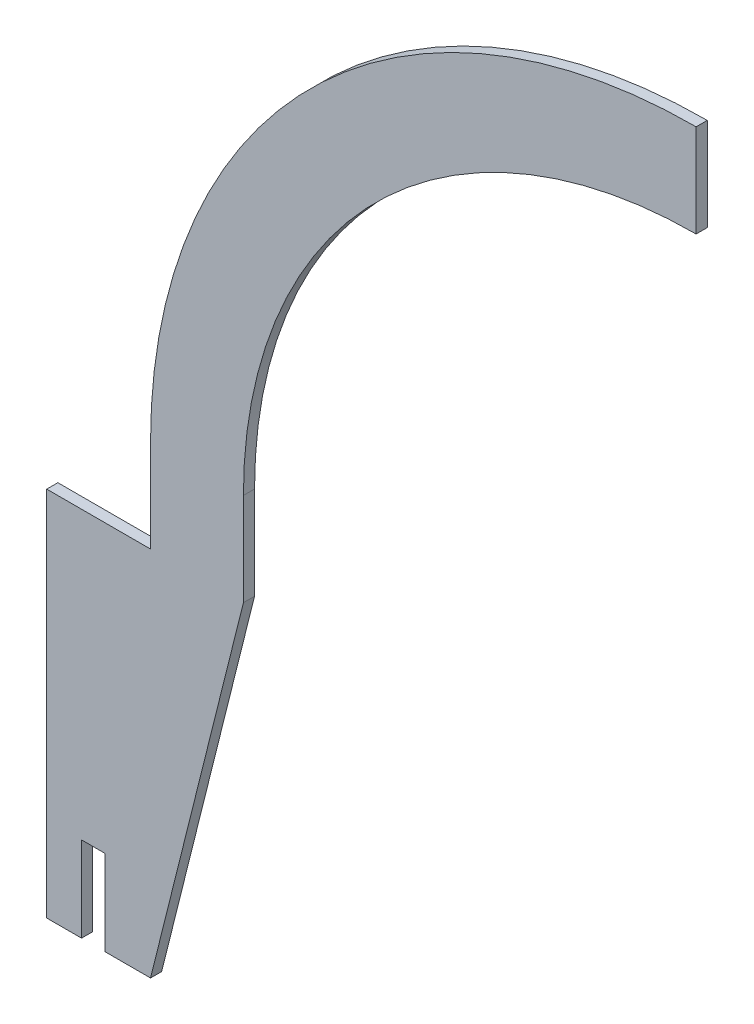
ISO-10303-21;
HEADER;
FILE_DESCRIPTION(('STEP AP214'),'2;1');
FILE_NAME('part.step','',(''),(''),'','','');
FILE_SCHEMA(('AUTOMOTIVE_DESIGN { 1 0 10303 214 1 1 1 1 }'));
ENDSEC;
DATA;
#1=APPLICATION_CONTEXT('core data for automotive mechanical design processes');
#2=APPLICATION_PROTOCOL_DEFINITION('international standard','automotive_design',2000,#1);
#3=PRODUCT_CONTEXT('',#1,'mechanical');
#4=PRODUCT('Part','Part','',(#3));
#5=PRODUCT_RELATED_PRODUCT_CATEGORY('part','',(#4));
#6=PRODUCT_DEFINITION_FORMATION('','',#4);
#7=PRODUCT_DEFINITION_CONTEXT('part definition',#1,'design');
#8=PRODUCT_DEFINITION('design','',#6,#7);
#9=PRODUCT_DEFINITION_SHAPE('','',#8);
#10=(LENGTH_UNIT() NAMED_UNIT(*) SI_UNIT(.MILLI.,.METRE.));
#11=(NAMED_UNIT(*) PLANE_ANGLE_UNIT() SI_UNIT($,.RADIAN.));
#12=(NAMED_UNIT(*) SI_UNIT($,.STERADIAN.) SOLID_ANGLE_UNIT());
#13=UNCERTAINTY_MEASURE_WITH_UNIT(LENGTH_MEASURE(1.E-05),#10,'distance_accuracy_value','');
#14=(GEOMETRIC_REPRESENTATION_CONTEXT(3) GLOBAL_UNCERTAINTY_ASSIGNED_CONTEXT((#13)) GLOBAL_UNIT_ASSIGNED_CONTEXT((#10,
#11,#12)) REPRESENTATION_CONTEXT('',''));
#15=CARTESIAN_POINT('',(0.,0.,0.));
#16=DIRECTION('',(0.,0.,1.));
#17=DIRECTION('',(1.,0.,0.));
#18=AXIS2_PLACEMENT_3D('',#15,#16,#17);
#19=CARTESIAN_POINT('',(-350.370896666281,573.937507263301,18.25625));
#20=DIRECTION('',(0.,0.,-1.));
#21=DIRECTION('',(-1.,0.,0.));
#22=AXIS2_PLACEMENT_3D('',#19,#20,#21);
#23=CYLINDRICAL_SURFACE('',#22,742.950000000001);
#24=CARTESIAN_POINT('',(-350.370896666281,573.937507263301,0.));
#25=DIRECTION('',(0.,0.,1.));
#26=DIRECTION('',(1.,0.,0.));
#27=AXIS2_PLACEMENT_3D('',#24,#25,#26);
#28=CIRCLE('',#27,742.950000000001);
#29=CARTESIAN_POINT('',(-350.370896666281,1316.8875072633,0.));
#30=VERTEX_POINT('',#29);
#31=CARTESIAN_POINT('',(-1093.32089666628,573.937507263301,0.));
#32=VERTEX_POINT('',#31);
#33=EDGE_CURVE('E158',#30,#32,#28,.T.);
#34=ORIENTED_EDGE('',*,*,#33,.F.);
#35=DIRECTION('',(0.,0.,-1.));
#36=VECTOR('',#35,1.);
#37=CARTESIAN_POINT('',(-350.370896666281,1316.8875072633,18.25625));
#38=LINE('',#37,#36);
#39=CARTESIAN_POINT('',(-350.370896666281,1316.8875072633,18.25625));
#40=VERTEX_POINT('',#39);
#41=EDGE_CURVE('E11',#40,#30,#38,.T.);
#42=ORIENTED_EDGE('',*,*,#41,.F.);
#43=CARTESIAN_POINT('',(-350.370896666281,573.937507263301,18.25625));
#44=DIRECTION('',(0.,0.,1.));
#45=DIRECTION('',(1.,0.,0.));
#46=AXIS2_PLACEMENT_3D('',#43,#44,#45);
#47=CIRCLE('',#46,742.950000000001);
#48=CARTESIAN_POINT('',(-1093.32089666628,573.937507263301,18.25625));
#49=VERTEX_POINT('',#48);
#50=EDGE_CURVE('E190',#40,#49,#47,.T.);
#51=ORIENTED_EDGE('',*,*,#50,.T.);
#52=DIRECTION('',(0.,0.,-1.));
#53=VECTOR('',#52,1.);
#54=CARTESIAN_POINT('',(-1093.32089666628,573.937507263301,18.25625));
#55=LINE('',#54,#53);
#56=EDGE_CURVE('E51',#49,#32,#55,.T.);
#57=ORIENTED_EDGE('',*,*,#56,.T.);
#58=EDGE_LOOP('',(#34,#42,#51,#57));
#59=FACE_BOUND('',#58,.T.);
#60=ADVANCED_FACE('F35',(#59),#23,.F.);
#61=CARTESIAN_POINT('',(-350.37089666628,-1.27621337479484E-13,18.25625));
#62=DIRECTION('',(1.,0.,0.));
#63=DIRECTION('',(0.,1.,0.));
#64=AXIS2_PLACEMENT_3D('',#61,#62,#63);
#65=PLANE('',#64);
#66=DIRECTION('',(0.,-1.,0.));
#67=VECTOR('',#66,1.);
#68=CARTESIAN_POINT('',(-350.37089666628,-1.27621337479484E-13,0.));
#69=LINE('',#68,#67);
#70=CARTESIAN_POINT('',(-350.370896666281,1469.2875072633,0.));
#71=VERTEX_POINT('',#70);
#72=EDGE_CURVE('E160',#71,#30,#69,.T.);
#73=ORIENTED_EDGE('',*,*,#72,.F.);
#74=DIRECTION('',(0.,0.,-1.));
#75=VECTOR('',#74,1.);
#76=CARTESIAN_POINT('',(-350.370896666281,1469.2875072633,18.25625));
#77=LINE('',#76,#75);
#78=CARTESIAN_POINT('',(-350.370896666281,1469.2875072633,18.25625));
#79=VERTEX_POINT('',#78);
#80=EDGE_CURVE('E43',#79,#71,#77,.T.);
#81=ORIENTED_EDGE('',*,*,#80,.F.);
#82=DIRECTION('',(0.,-1.,0.));
#83=VECTOR('',#82,1.);
#84=CARTESIAN_POINT('',(-350.37089666628,-1.27621337479484E-13,18.25625));
#85=LINE('',#84,#83);
#86=EDGE_CURVE('E223',#79,#40,#85,.T.);
#87=ORIENTED_EDGE('',*,*,#86,.T.);
#88=ORIENTED_EDGE('',*,*,#41,.T.);
#89=EDGE_LOOP('',(#73,#81,#87,#88));
#90=FACE_BOUND('',#89,.T.);
#91=ADVANCED_FACE('F222',(#90),#65,.T.);
#92=CARTESIAN_POINT('',(-350.370896666281,573.937507263301,18.25625));
#93=DIRECTION('',(0.,0.,-1.));
#94=DIRECTION('',(-1.,0.,0.));
#95=AXIS2_PLACEMENT_3D('',#92,#93,#94);
#96=CYLINDRICAL_SURFACE('',#95,895.35);
#97=CARTESIAN_POINT('',(-350.370896666281,573.937507263301,0.));
#98=DIRECTION('',(0.,0.,1.));
#99=DIRECTION('',(1.,0.,0.));
#100=AXIS2_PLACEMENT_3D('',#97,#98,#99);
#101=CIRCLE('',#100,895.35);
#102=CARTESIAN_POINT('',(-1245.72089666628,573.937507263301,0.));
#103=VERTEX_POINT('',#102);
#104=EDGE_CURVE('E163',#71,#103,#101,.T.);
#105=ORIENTED_EDGE('',*,*,#104,.T.);
#106=DIRECTION('',(0.,0.,-1.));
#107=VECTOR('',#106,1.);
#108=CARTESIAN_POINT('',(-1245.72089666628,573.937507263301,18.25625));
#109=LINE('',#108,#107);
#110=CARTESIAN_POINT('',(-1245.72089666628,573.937507263301,18.25625));
#111=VERTEX_POINT('',#110);
#112=EDGE_CURVE('E208',#111,#103,#109,.T.);
#113=ORIENTED_EDGE('',*,*,#112,.F.);
#114=CARTESIAN_POINT('',(-350.370896666281,573.937507263301,18.25625));
#115=DIRECTION('',(0.,0.,1.));
#116=DIRECTION('',(1.,0.,0.));
#117=AXIS2_PLACEMENT_3D('',#114,#115,#116);
#118=CIRCLE('',#117,895.35);
#119=EDGE_CURVE('E214',#79,#111,#118,.T.);
#120=ORIENTED_EDGE('',*,*,#119,.F.);
#121=ORIENTED_EDGE('',*,*,#80,.T.);
#122=EDGE_LOOP('',(#105,#113,#120,#121));
#123=FACE_BOUND('',#122,.T.);
#124=ADVANCED_FACE('F212',(#123),#96,.T.);
#125=CARTESIAN_POINT('',(-1245.72089666628,0.,18.25625));
#126=DIRECTION('',(-1.,0.,0.));
#127=DIRECTION('',(0.,0.,1.));
#128=AXIS2_PLACEMENT_3D('',#125,#126,#127);
#129=PLANE('',#128);
#130=DIRECTION('',(0.,1.,0.));
#131=VECTOR('',#130,1.);
#132=CARTESIAN_POINT('',(-1245.72089666628,0.,0.));
#133=LINE('',#132,#131);
#134=CARTESIAN_POINT('',(-1245.72089666628,421.537507263301,0.));
#135=VERTEX_POINT('',#134);
#136=EDGE_CURVE('E166',#135,#103,#133,.T.);
#137=ORIENTED_EDGE('',*,*,#136,.F.);
#138=DIRECTION('',(0.,0.,-1.));
#139=VECTOR('',#138,1.);
#140=CARTESIAN_POINT('',(-1245.72089666628,421.537507263301,18.25625));
#141=LINE('',#140,#139);
#142=CARTESIAN_POINT('',(-1245.72089666628,421.537507263301,18.25625));
#143=VERTEX_POINT('',#142);
#144=EDGE_CURVE('E206',#143,#135,#141,.T.);
#145=ORIENTED_EDGE('',*,*,#144,.F.);
#146=DIRECTION('',(0.,1.,0.));
#147=VECTOR('',#146,1.);
#148=CARTESIAN_POINT('',(-1245.72089666628,0.,18.25625));
#149=LINE('',#148,#147);
#150=EDGE_CURVE('E383',#143,#111,#149,.T.);
#151=ORIENTED_EDGE('',*,*,#150,.T.);
#152=ORIENTED_EDGE('',*,*,#112,.T.);
#153=EDGE_LOOP('',(#137,#145,#151,#152));
#154=FACE_BOUND('',#153,.T.);
#155=ADVANCED_FACE('F241',(#154),#129,.T.);
#156=CARTESIAN_POINT('',(0.,421.537507263301,18.25625));
#157=DIRECTION('',(0.,1.,0.));
#158=DIRECTION('',(0.,0.,1.));
#159=AXIS2_PLACEMENT_3D('',#156,#157,#158);
#160=PLANE('',#159);
#161=DIRECTION('',(1.,0.,0.));
#162=VECTOR('',#161,1.);
#163=CARTESIAN_POINT('',(0.,421.537507263301,0.));
#164=LINE('',#163,#162);
#165=CARTESIAN_POINT('',(-1416.06507069509,421.537507263301,0.));
#166=VERTEX_POINT('',#165);
#167=EDGE_CURVE('E169',#166,#135,#164,.T.);
#168=ORIENTED_EDGE('',*,*,#167,.F.);
#169=DIRECTION('',(0.,0.,-1.));
#170=VECTOR('',#169,1.);
#171=CARTESIAN_POINT('',(-1416.06507069509,421.537507263301,18.25625));
#172=LINE('',#171,#170);
#173=CARTESIAN_POINT('',(-1416.06507069509,421.537507263301,18.25625));
#174=VERTEX_POINT('',#173);
#175=EDGE_CURVE('E204',#174,#166,#172,.T.);
#176=ORIENTED_EDGE('',*,*,#175,.F.);
#177=DIRECTION('',(1.,0.,0.));
#178=VECTOR('',#177,1.);
#179=CARTESIAN_POINT('',(0.,421.537507263301,18.25625));
#180=LINE('',#179,#178);
#181=EDGE_CURVE('E380',#174,#143,#180,.T.);
#182=ORIENTED_EDGE('',*,*,#181,.T.);
#183=ORIENTED_EDGE('',*,*,#144,.T.);
#184=EDGE_LOOP('',(#168,#176,#182,#183));
#185=FACE_BOUND('',#184,.T.);
#186=ADVANCED_FACE('F246',(#185),#160,.T.);
#187=CARTESIAN_POINT('',(-1416.06507069509,0.,18.25625));
#188=DIRECTION('',(1.,0.,0.));
#189=DIRECTION('',(0.,0.,-1.));
#190=AXIS2_PLACEMENT_3D('',#187,#188,#189);
#191=PLANE('',#190);
#192=DIRECTION('',(0.,-1.,0.));
#193=VECTOR('',#192,1.);
#194=CARTESIAN_POINT('',(-1416.06507069509,0.,0.));
#195=LINE('',#194,#193);
#196=CARTESIAN_POINT('',(-1416.06507069509,-188.062492736699,0.));
#197=VERTEX_POINT('',#196);
#198=EDGE_CURVE('E172',#166,#197,#195,.T.);
#199=ORIENTED_EDGE('',*,*,#198,.T.);
#200=DIRECTION('',(0.,0.,-1.));
#201=VECTOR('',#200,1.);
#202=CARTESIAN_POINT('',(-1416.06507069509,-188.062492736699,18.25625));
#203=LINE('',#202,#201);
#204=CARTESIAN_POINT('',(-1416.06507069509,-188.062492736699,18.25625));
#205=VERTEX_POINT('',#204);
#206=EDGE_CURVE('E201',#205,#197,#203,.T.);
#207=ORIENTED_EDGE('',*,*,#206,.F.);
#208=DIRECTION('',(0.,-1.,0.));
#209=VECTOR('',#208,1.);
#210=CARTESIAN_POINT('',(-1416.06507069509,0.,18.25625));
#211=LINE('',#210,#209);
#212=EDGE_CURVE('E385',#174,#205,#211,.T.);
#213=ORIENTED_EDGE('',*,*,#212,.F.);
#214=ORIENTED_EDGE('',*,*,#175,.T.);
#215=EDGE_LOOP('',(#199,#207,#213,#214));
#216=FACE_BOUND('',#215,.T.);
#217=ADVANCED_FACE('F250',(#216),#191,.F.);
#218=CARTESIAN_POINT('',(0.,-188.062492736699,18.25625));
#219=DIRECTION('',(0.,1.,0.));
#220=DIRECTION('',(0.,0.,1.));
#221=AXIS2_PLACEMENT_3D('',#218,#219,#220);
#222=PLANE('',#221);
#223=DIRECTION('',(1.,0.,0.));
#224=VECTOR('',#223,1.);
#225=CARTESIAN_POINT('',(0.,-188.062492736699,0.));
#226=LINE('',#225,#224);
#227=CARTESIAN_POINT('',(-1358.91507069509,-188.062492736699,0.));
#228=VERTEX_POINT('',#227);
#229=EDGE_CURVE('E174',#197,#228,#226,.T.);
#230=ORIENTED_EDGE('',*,*,#229,.T.);
#231=DIRECTION('',(0.,0.,-1.));
#232=VECTOR('',#231,1.);
#233=CARTESIAN_POINT('',(-1358.91507069509,-188.062492736699,18.25625));
#234=LINE('',#233,#232);
#235=CARTESIAN_POINT('',(-1358.91507069509,-188.062492736699,18.25625));
#236=VERTEX_POINT('',#235);
#237=EDGE_CURVE('E199',#236,#228,#234,.T.);
#238=ORIENTED_EDGE('',*,*,#237,.F.);
#239=DIRECTION('',(1.,0.,0.));
#240=VECTOR('',#239,1.);
#241=CARTESIAN_POINT('',(0.,-188.062492736699,18.25625));
#242=LINE('',#241,#240);
#243=EDGE_CURVE('E391',#205,#236,#242,.T.);
#244=ORIENTED_EDGE('',*,*,#243,.F.);
#245=ORIENTED_EDGE('',*,*,#206,.T.);
#246=EDGE_LOOP('',(#230,#238,#244,#245));
#247=FACE_BOUND('',#246,.T.);
#248=ADVANCED_FACE('F254',(#247),#222,.F.);
#249=CARTESIAN_POINT('',(-1358.91507069509,0.,18.25625));
#250=DIRECTION('',(1.,0.,0.));
#251=DIRECTION('',(0.,0.,-1.));
#252=AXIS2_PLACEMENT_3D('',#249,#250,#251);
#253=PLANE('',#252);
#254=DIRECTION('',(0.,-1.,0.));
#255=VECTOR('',#254,1.);
#256=CARTESIAN_POINT('',(-1358.91507069509,0.,0.));
#257=LINE('',#256,#255);
#258=CARTESIAN_POINT('',(-1358.91507069509,-48.3624927366991,0.));
#259=VERTEX_POINT('',#258);
#260=EDGE_CURVE('E177',#259,#228,#257,.T.);
#261=ORIENTED_EDGE('',*,*,#260,.F.);
#262=DIRECTION('',(0.,0.,-1.));
#263=VECTOR('',#262,1.);
#264=CARTESIAN_POINT('',(-1358.91507069509,-48.3624927366991,18.25625));
#265=LINE('',#264,#263);
#266=CARTESIAN_POINT('',(-1358.91507069509,-48.3624927366991,18.25625));
#267=VERTEX_POINT('',#266);
#268=EDGE_CURVE('E197',#267,#259,#265,.T.);
#269=ORIENTED_EDGE('',*,*,#268,.F.);
#270=DIRECTION('',(0.,-1.,0.));
#271=VECTOR('',#270,1.);
#272=CARTESIAN_POINT('',(-1358.91507069509,0.,18.25625));
#273=LINE('',#272,#271);
#274=EDGE_CURVE('E372',#267,#236,#273,.T.);
#275=ORIENTED_EDGE('',*,*,#274,.T.);
#276=ORIENTED_EDGE('',*,*,#237,.T.);
#277=EDGE_LOOP('',(#261,#269,#275,#276));
#278=FACE_BOUND('',#277,.T.);
#279=ADVANCED_FACE('F258',(#278),#253,.T.);
#280=CARTESIAN_POINT('',(0.,-48.3624927366991,18.25625));
#281=DIRECTION('',(0.,1.,0.));
#282=DIRECTION('',(0.,0.,1.));
#283=AXIS2_PLACEMENT_3D('',#280,#281,#282);
#284=PLANE('',#283);
#285=DIRECTION('',(1.,0.,0.));
#286=VECTOR('',#285,1.);
#287=CARTESIAN_POINT('',(0.,-48.3624927366991,0.));
#288=LINE('',#287,#286);
#289=CARTESIAN_POINT('',(-1320.81507069509,-48.3624927366991,0.));
#290=VERTEX_POINT('',#289);
#291=EDGE_CURVE('E180',#259,#290,#288,.T.);
#292=ORIENTED_EDGE('',*,*,#291,.T.);
#293=DIRECTION('',(0.,0.,-1.));
#294=VECTOR('',#293,1.);
#295=CARTESIAN_POINT('',(-1320.81507069509,-48.3624927366991,18.25625));
#296=LINE('',#295,#294);
#297=CARTESIAN_POINT('',(-1320.81507069509,-48.3624927366991,18.25625));
#298=VERTEX_POINT('',#297);
#299=EDGE_CURVE('E194',#298,#290,#296,.T.);
#300=ORIENTED_EDGE('',*,*,#299,.F.);
#301=DIRECTION('',(1.,0.,0.));
#302=VECTOR('',#301,1.);
#303=CARTESIAN_POINT('',(0.,-48.3624927366991,18.25625));
#304=LINE('',#303,#302);
#305=EDGE_CURVE('E394',#267,#298,#304,.T.);
#306=ORIENTED_EDGE('',*,*,#305,.F.);
#307=ORIENTED_EDGE('',*,*,#268,.T.);
#308=EDGE_LOOP('',(#292,#300,#306,#307));
#309=FACE_BOUND('',#308,.T.);
#310=ADVANCED_FACE('F262',(#309),#284,.F.);
#311=CARTESIAN_POINT('',(-1320.81507069509,0.,18.25625));
#312=DIRECTION('',(1.,0.,0.));
#313=DIRECTION('',(0.,0.,-1.));
#314=AXIS2_PLACEMENT_3D('',#311,#312,#313);
#315=PLANE('',#314);
#316=DIRECTION('',(0.,-1.,0.));
#317=VECTOR('',#316,1.);
#318=CARTESIAN_POINT('',(-1320.81507069509,0.,0.));
#319=LINE('',#318,#317);
#320=CARTESIAN_POINT('',(-1320.81507069509,-188.062492736699,0.));
#321=VERTEX_POINT('',#320);
#322=EDGE_CURVE('E182',#290,#321,#319,.T.);
#323=ORIENTED_EDGE('',*,*,#322,.T.);
#324=DIRECTION('',(0.,0.,-1.));
#325=VECTOR('',#324,1.);
#326=CARTESIAN_POINT('',(-1320.81507069509,-188.062492736699,18.25625));
#327=LINE('',#326,#325);
#328=CARTESIAN_POINT('',(-1320.81507069509,-188.062492736699,18.25625));
#329=VERTEX_POINT('',#328);
#330=EDGE_CURVE('E150',#329,#321,#327,.T.);
#331=ORIENTED_EDGE('',*,*,#330,.F.);
#332=DIRECTION('',(0.,-1.,0.));
#333=VECTOR('',#332,1.);
#334=CARTESIAN_POINT('',(-1320.81507069509,0.,18.25625));
#335=LINE('',#334,#333);
#336=EDGE_CURVE('E138',#298,#329,#335,.T.);
#337=ORIENTED_EDGE('',*,*,#336,.F.);
#338=ORIENTED_EDGE('',*,*,#299,.T.);
#339=EDGE_LOOP('',(#323,#331,#337,#338));
#340=FACE_BOUND('',#339,.T.);
#341=ADVANCED_FACE('F266',(#340),#315,.F.);
#342=CARTESIAN_POINT('',(0.,-188.062492736699,18.25625));
#343=DIRECTION('',(0.,1.,0.));
#344=DIRECTION('',(0.,0.,1.));
#345=AXIS2_PLACEMENT_3D('',#342,#343,#344);
#346=PLANE('',#345);
#347=DIRECTION('',(1.,0.,0.));
#348=VECTOR('',#347,1.);
#349=CARTESIAN_POINT('',(0.,-188.062492736699,0.));
#350=LINE('',#349,#348);
#351=CARTESIAN_POINT('',(-1245.72089666628,-188.062492736699,0.));
#352=VERTEX_POINT('',#351);
#353=EDGE_CURVE('E147',#321,#352,#350,.T.);
#354=ORIENTED_EDGE('',*,*,#353,.T.);
#355=DIRECTION('',(0.,0.,-1.));
#356=VECTOR('',#355,1.);
#357=CARTESIAN_POINT('',(-1245.72089666628,-188.062492736699,18.25625));
#358=LINE('',#357,#356);
#359=CARTESIAN_POINT('',(-1245.72089666628,-188.062492736699,18.25625));
#360=VERTEX_POINT('',#359);
#361=EDGE_CURVE('E144',#360,#352,#358,.T.);
#362=ORIENTED_EDGE('',*,*,#361,.F.);
#363=DIRECTION('',(1.,0.,0.));
#364=VECTOR('',#363,1.);
#365=CARTESIAN_POINT('',(0.,-188.062492736699,18.25625));
#366=LINE('',#365,#364);
#367=EDGE_CURVE('E131',#329,#360,#366,.T.);
#368=ORIENTED_EDGE('',*,*,#367,.F.);
#369=ORIENTED_EDGE('',*,*,#330,.T.);
#370=EDGE_LOOP('',(#354,#362,#368,#369));
#371=FACE_BOUND('',#370,.T.);
#372=ADVANCED_FACE('F145',(#371),#346,.F.);
#373=CARTESIAN_POINT('',(-1128.19319857139,282.048299642847,18.25625));
#374=DIRECTION('',(-0.970142500145332,0.242535625036332,0.));
#375=DIRECTION('',(-0.242535625036332,-0.970142500145332,0.));
#376=AXIS2_PLACEMENT_3D('',#373,#374,#375);
#377=PLANE('',#376);
#378=DIRECTION('',(0.242535625036332,0.970142500145332,0.));
#379=VECTOR('',#378,1.);
#380=CARTESIAN_POINT('',(-1128.19319857139,282.048299642847,0.));
#381=LINE('',#380,#379);
#382=CARTESIAN_POINT('',(-1093.32089666628,421.537507263301,0.));
#383=VERTEX_POINT('',#382);
#384=EDGE_CURVE('E185',#352,#383,#381,.T.);
#385=ORIENTED_EDGE('',*,*,#384,.T.);
#386=DIRECTION('',(0.,0.,-1.));
#387=VECTOR('',#386,1.);
#388=CARTESIAN_POINT('',(-1093.32089666628,421.537507263301,18.25625));
#389=LINE('',#388,#387);
#390=CARTESIAN_POINT('',(-1093.32089666628,421.537507263301,18.25625));
#391=VERTEX_POINT('',#390);
#392=EDGE_CURVE('E92',#391,#383,#389,.T.);
#393=ORIENTED_EDGE('',*,*,#392,.F.);
#394=DIRECTION('',(0.242535625036332,0.970142500145332,0.));
#395=VECTOR('',#394,1.);
#396=CARTESIAN_POINT('',(-1128.19319857139,282.048299642847,18.25625));
#397=LINE('',#396,#395);
#398=EDGE_CURVE('E136',#360,#391,#397,.T.);
#399=ORIENTED_EDGE('',*,*,#398,.F.);
#400=ORIENTED_EDGE('',*,*,#361,.T.);
#401=EDGE_LOOP('',(#385,#393,#399,#400));
#402=FACE_BOUND('',#401,.T.);
#403=ADVANCED_FACE('F152',(#402),#377,.F.);
#404=CARTESIAN_POINT('',(-1093.32089666628,0.,18.25625));
#405=DIRECTION('',(1.,0.,0.));
#406=DIRECTION('',(0.,0.,-1.));
#407=AXIS2_PLACEMENT_3D('',#404,#405,#406);
#408=PLANE('',#407);
#409=DIRECTION('',(0.,-1.,0.));
#410=VECTOR('',#409,1.);
#411=CARTESIAN_POINT('',(-1093.32089666628,0.,0.));
#412=LINE('',#411,#410);
#413=EDGE_CURVE('E187',#32,#383,#412,.T.);
#414=ORIENTED_EDGE('',*,*,#413,.F.);
#415=ORIENTED_EDGE('',*,*,#56,.F.);
#416=DIRECTION('',(0.,-1.,0.));
#417=VECTOR('',#416,1.);
#418=CARTESIAN_POINT('',(-1093.32089666628,0.,18.25625));
#419=LINE('',#418,#417);
#420=EDGE_CURVE('E153',#49,#391,#419,.T.);
#421=ORIENTED_EDGE('',*,*,#420,.T.);
#422=ORIENTED_EDGE('',*,*,#392,.T.);
#423=EDGE_LOOP('',(#414,#415,#421,#422));
#424=FACE_BOUND('',#423,.T.);
#425=ADVANCED_FACE('F224',(#424),#408,.T.);
#426=CARTESIAN_POINT('',(0.,0.,18.25625));
#427=DIRECTION('',(0.,0.,1.));
#428=DIRECTION('',(1.,0.,0.));
#429=AXIS2_PLACEMENT_3D('',#426,#427,#428);
#430=PLANE('',#429);
#431=ORIENTED_EDGE('',*,*,#50,.F.);
#432=ORIENTED_EDGE('',*,*,#86,.F.);
#433=ORIENTED_EDGE('',*,*,#119,.T.);
#434=ORIENTED_EDGE('',*,*,#150,.F.);
#435=ORIENTED_EDGE('',*,*,#181,.F.);
#436=ORIENTED_EDGE('',*,*,#212,.T.);
#437=ORIENTED_EDGE('',*,*,#243,.T.);
#438=ORIENTED_EDGE('',*,*,#274,.F.);
#439=ORIENTED_EDGE('',*,*,#305,.T.);
#440=ORIENTED_EDGE('',*,*,#336,.T.);
#441=ORIENTED_EDGE('',*,*,#367,.T.);
#442=ORIENTED_EDGE('',*,*,#398,.T.);
#443=ORIENTED_EDGE('',*,*,#420,.F.);
#444=EDGE_LOOP('',(#431,#432,#433,#434,#435,#436,#437,#438,#439,#440,#441,#442,#443));
#445=FACE_BOUND('',#444,.T.);
#446=ADVANCED_FACE('F133',(#445),#430,.T.);
#447=CARTESIAN_POINT('',(0.,0.,0.));
#448=DIRECTION('',(0.,0.,1.));
#449=DIRECTION('',(1.,0.,0.));
#450=AXIS2_PLACEMENT_3D('',#447,#448,#449);
#451=PLANE('',#450);
#452=ORIENTED_EDGE('',*,*,#33,.T.);
#453=ORIENTED_EDGE('',*,*,#413,.T.);
#454=ORIENTED_EDGE('',*,*,#384,.F.);
#455=ORIENTED_EDGE('',*,*,#353,.F.);
#456=ORIENTED_EDGE('',*,*,#322,.F.);
#457=ORIENTED_EDGE('',*,*,#291,.F.);
#458=ORIENTED_EDGE('',*,*,#260,.T.);
#459=ORIENTED_EDGE('',*,*,#229,.F.);
#460=ORIENTED_EDGE('',*,*,#198,.F.);
#461=ORIENTED_EDGE('',*,*,#167,.T.);
#462=ORIENTED_EDGE('',*,*,#136,.T.);
#463=ORIENTED_EDGE('',*,*,#104,.F.);
#464=ORIENTED_EDGE('',*,*,#72,.T.);
#465=EDGE_LOOP('',(#452,#453,#454,#455,#456,#457,#458,#459,#460,#461,#462,#463,#464));
#466=FACE_BOUND('',#465,.T.);
#467=ADVANCED_FACE('F220',(#466),#451,.F.);
#468=CLOSED_SHELL('',(#60,#91,#124,#155,#186,#217,#248,#279,#310,#341,#372,#403,#425,#446,#467));
#469=MANIFOLD_SOLID_BREP('B2',#468);
#470=ADVANCED_BREP_SHAPE_REPRESENTATION('',(#18,#469),#14);
#471=SHAPE_DEFINITION_REPRESENTATION(#9,#470);
ENDSEC;
END-ISO-10303-21;
